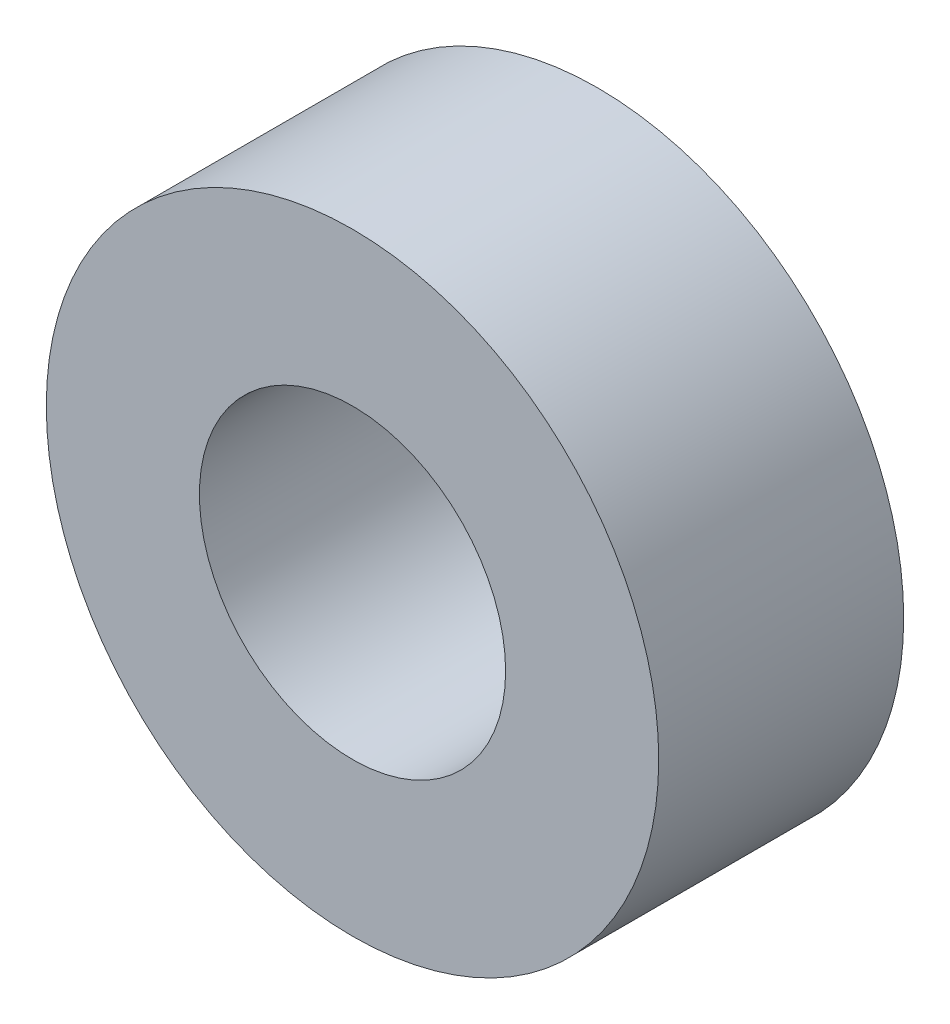
ISO-10303-21;
HEADER;
FILE_DESCRIPTION(('STEP AP214'),'2;1');
FILE_NAME('part.step','',(''),(''),'','','');
FILE_SCHEMA(('AUTOMOTIVE_DESIGN { 1 0 10303 214 1 1 1 1 }'));
ENDSEC;
DATA;
#1=APPLICATION_CONTEXT('core data for automotive mechanical design processes');
#2=APPLICATION_PROTOCOL_DEFINITION('international standard','automotive_design',2000,#1);
#3=PRODUCT_CONTEXT('',#1,'mechanical');
#4=PRODUCT('Part','Part','',(#3));
#5=PRODUCT_RELATED_PRODUCT_CATEGORY('part','',(#4));
#6=PRODUCT_DEFINITION_FORMATION('','',#4);
#7=PRODUCT_DEFINITION_CONTEXT('part definition',#1,'design');
#8=PRODUCT_DEFINITION('design','',#6,#7);
#9=PRODUCT_DEFINITION_SHAPE('','',#8);
#10=(LENGTH_UNIT() NAMED_UNIT(*) SI_UNIT(.MILLI.,.METRE.));
#11=(NAMED_UNIT(*) PLANE_ANGLE_UNIT() SI_UNIT($,.RADIAN.));
#12=(NAMED_UNIT(*) SI_UNIT($,.STERADIAN.) SOLID_ANGLE_UNIT());
#13=UNCERTAINTY_MEASURE_WITH_UNIT(LENGTH_MEASURE(1.E-05),#10,'distance_accuracy_value','');
#14=(GEOMETRIC_REPRESENTATION_CONTEXT(3) GLOBAL_UNCERTAINTY_ASSIGNED_CONTEXT((#13)) GLOBAL_UNIT_ASSIGNED_CONTEXT((#10,
#11,#12)) REPRESENTATION_CONTEXT('',''));
#15=CARTESIAN_POINT('',(0.,0.,0.));
#16=DIRECTION('',(0.,0.,1.));
#17=DIRECTION('',(1.,0.,0.));
#18=AXIS2_PLACEMENT_3D('',#15,#16,#17);
#19=CARTESIAN_POINT('',(0.,0.,2.));
#20=DIRECTION('',(0.,0.,1.));
#21=DIRECTION('',(1.,0.,0.));
#22=AXIS2_PLACEMENT_3D('',#19,#20,#21);
#23=PLANE('',#22);
#24=CARTESIAN_POINT('',(0.,0.,2.));
#25=DIRECTION('',(0.,0.,1.));
#26=DIRECTION('',(1.,0.,0.));
#27=AXIS2_PLACEMENT_3D('',#24,#25,#26);
#28=CIRCLE('',#27,5.);
#29=CARTESIAN_POINT('',(5.,0.,2.));
#30=VERTEX_POINT('',#29);
#31=EDGE_CURVE('E10',#30,#30,#28,.T.);
#32=ORIENTED_EDGE('',*,*,#31,.T.);
#33=EDGE_LOOP('',(#32));
#34=FACE_BOUND('',#33,.T.);
#35=CARTESIAN_POINT('',(0.,0.,2.));
#36=DIRECTION('',(0.,0.,1.));
#37=DIRECTION('',(1.,0.,0.));
#38=AXIS2_PLACEMENT_3D('',#35,#36,#37);
#39=CIRCLE('',#38,2.5);
#40=CARTESIAN_POINT('',(2.5,0.,2.));
#41=VERTEX_POINT('',#40);
#42=EDGE_CURVE('E47',#41,#41,#39,.T.);
#43=ORIENTED_EDGE('',*,*,#42,.F.);
#44=EDGE_LOOP('',(#43));
#45=FACE_BOUND('',#44,.T.);
#46=ADVANCED_FACE('F32',(#34,#45),#23,.T.);
#47=CARTESIAN_POINT('',(0.,0.,-2.));
#48=DIRECTION('',(0.,0.,1.));
#49=DIRECTION('',(1.,0.,0.));
#50=AXIS2_PLACEMENT_3D('',#47,#48,#49);
#51=PLANE('',#50);
#52=CARTESIAN_POINT('',(0.,0.,-2.));
#53=DIRECTION('',(0.,0.,1.));
#54=DIRECTION('',(1.,0.,0.));
#55=AXIS2_PLACEMENT_3D('',#52,#53,#54);
#56=CIRCLE('',#55,5.);
#57=CARTESIAN_POINT('',(5.,0.,-2.));
#58=VERTEX_POINT('',#57);
#59=EDGE_CURVE('E36',#58,#58,#56,.T.);
#60=ORIENTED_EDGE('',*,*,#59,.F.);
#61=EDGE_LOOP('',(#60));
#62=FACE_BOUND('',#61,.T.);
#63=CARTESIAN_POINT('',(0.,0.,-2.));
#64=DIRECTION('',(0.,0.,1.));
#65=DIRECTION('',(1.,0.,0.));
#66=AXIS2_PLACEMENT_3D('',#63,#64,#65);
#67=CIRCLE('',#66,2.5);
#68=CARTESIAN_POINT('',(2.5,0.,-2.));
#69=VERTEX_POINT('',#68);
#70=EDGE_CURVE('E49',#69,#69,#67,.T.);
#71=ORIENTED_EDGE('',*,*,#70,.T.);
#72=EDGE_LOOP('',(#71));
#73=FACE_BOUND('',#72,.T.);
#74=ADVANCED_FACE('F59',(#62,#73),#51,.F.);
#75=CARTESIAN_POINT('',(0.,0.,2.));
#76=DIRECTION('',(0.,0.,-1.));
#77=DIRECTION('',(-1.,0.,0.));
#78=AXIS2_PLACEMENT_3D('',#75,#76,#77);
#79=CYLINDRICAL_SURFACE('',#78,5.);
#80=ORIENTED_EDGE('',*,*,#31,.F.);
#81=EDGE_LOOP('',(#80));
#82=FACE_BOUND('',#81,.T.);
#83=ORIENTED_EDGE('',*,*,#59,.T.);
#84=EDGE_LOOP('',(#83));
#85=FACE_BOUND('',#84,.T.);
#86=ADVANCED_FACE('F34',(#82,#85),#79,.T.);
#87=CARTESIAN_POINT('',(0.,0.,2.));
#88=DIRECTION('',(0.,0.,-1.));
#89=DIRECTION('',(-1.,0.,0.));
#90=AXIS2_PLACEMENT_3D('',#87,#88,#89);
#91=CYLINDRICAL_SURFACE('',#90,2.5);
#92=ORIENTED_EDGE('',*,*,#42,.T.);
#93=EDGE_LOOP('',(#92));
#94=FACE_BOUND('',#93,.T.);
#95=ORIENTED_EDGE('',*,*,#70,.F.);
#96=EDGE_LOOP('',(#95));
#97=FACE_BOUND('',#96,.T.);
#98=ADVANCED_FACE('F55',(#94,#97),#91,.F.);
#99=CLOSED_SHELL('',(#46,#74,#86,#98));
#100=MANIFOLD_SOLID_BREP('B2',#99);
#101=ADVANCED_BREP_SHAPE_REPRESENTATION('',(#18,#100),#14);
#102=SHAPE_DEFINITION_REPRESENTATION(#9,#101);
ENDSEC;
END-ISO-10303-21;
